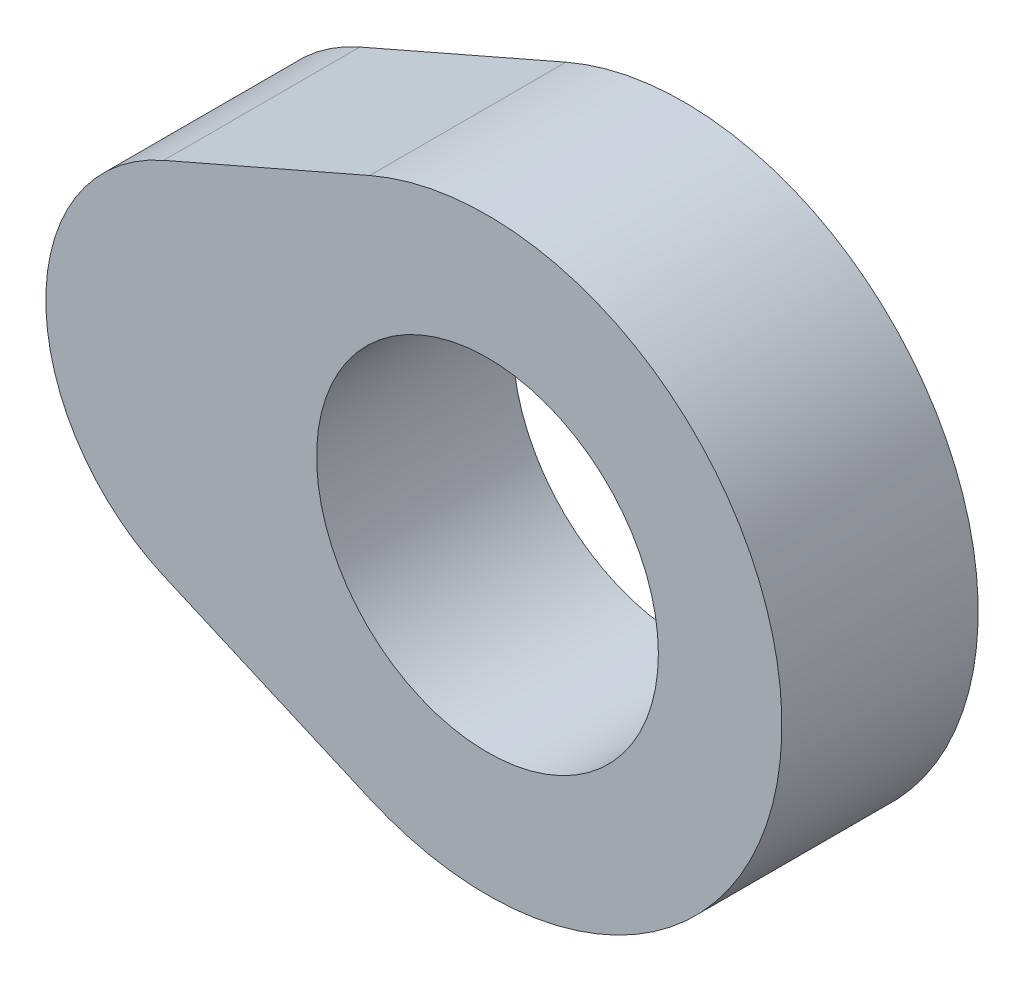
ISO-10303-21;
HEADER;
FILE_DESCRIPTION(('STEP AP214'),'2;1');
FILE_NAME('part.step','',(''),(''),'','','');
FILE_SCHEMA(('AUTOMOTIVE_DESIGN { 1 0 10303 214 1 1 1 1 }'));
ENDSEC;
DATA;
#1=APPLICATION_CONTEXT('core data for automotive mechanical design processes');
#2=APPLICATION_PROTOCOL_DEFINITION('international standard','automotive_design',2000,#1);
#3=PRODUCT_CONTEXT('',#1,'mechanical');
#4=PRODUCT('Part','Part','',(#3));
#5=PRODUCT_RELATED_PRODUCT_CATEGORY('part','',(#4));
#6=PRODUCT_DEFINITION_FORMATION('','',#4);
#7=PRODUCT_DEFINITION_CONTEXT('part definition',#1,'design');
#8=PRODUCT_DEFINITION('design','',#6,#7);
#9=PRODUCT_DEFINITION_SHAPE('','',#8);
#10=(LENGTH_UNIT() NAMED_UNIT(*) SI_UNIT(.MILLI.,.METRE.));
#11=(NAMED_UNIT(*) PLANE_ANGLE_UNIT() SI_UNIT($,.RADIAN.));
#12=(NAMED_UNIT(*) SI_UNIT($,.STERADIAN.) SOLID_ANGLE_UNIT());
#13=UNCERTAINTY_MEASURE_WITH_UNIT(LENGTH_MEASURE(1.E-05),#10,'distance_accuracy_value','');
#14=(GEOMETRIC_REPRESENTATION_CONTEXT(3) GLOBAL_UNCERTAINTY_ASSIGNED_CONTEXT((#13)) GLOBAL_UNIT_ASSIGNED_CONTEXT((#10,
#11,#12)) REPRESENTATION_CONTEXT('',''));
#15=CARTESIAN_POINT('',(0.,0.,0.));
#16=DIRECTION('',(0.,0.,1.));
#17=DIRECTION('',(1.,0.,0.));
#18=AXIS2_PLACEMENT_3D('',#15,#16,#17);
#19=CARTESIAN_POINT('',(0.,0.,20.));
#20=DIRECTION('',(0.,0.,1.));
#21=DIRECTION('',(1.,0.,0.));
#22=AXIS2_PLACEMENT_3D('',#19,#20,#21);
#23=PLANE('',#22);
#24=CARTESIAN_POINT('',(0.,0.,20.));
#25=DIRECTION('',(0.,0.,1.));
#26=DIRECTION('',(1.,0.,0.));
#27=AXIS2_PLACEMENT_3D('',#24,#25,#26);
#28=CIRCLE('',#27,60.);
#29=CARTESIAN_POINT('',(-24.,-54.9909083394701,20.));
#30=VERTEX_POINT('',#29);
#31=CARTESIAN_POINT('',(-24.,54.9909083394701,20.));
#32=VERTEX_POINT('',#31);
#33=EDGE_CURVE('E96',#30,#32,#28,.T.);
#34=ORIENTED_EDGE('',*,*,#33,.T.);
#35=DIRECTION('',(-0.916515138991168,-0.4,0.));
#36=VECTOR('',#35,1.);
#37=CARTESIAN_POINT('',(-65.9999999999992,36.6606055596471,20.));
#38=LINE('',#37,#36);
#39=CARTESIAN_POINT('',(-65.9999999999992,36.6606055596471,20.));
#40=VERTEX_POINT('',#39);
#41=EDGE_CURVE('E91',#32,#40,#38,.T.);
#42=ORIENTED_EDGE('',*,*,#41,.T.);
#43=CARTESIAN_POINT('',(-50.,0.,20.));
#44=DIRECTION('',(0.,0.,1.));
#45=DIRECTION('',(-1.,0.,0.));
#46=AXIS2_PLACEMENT_3D('',#43,#44,#45);
#47=CIRCLE('',#46,40.);
#48=CARTESIAN_POINT('',(-65.9999999999992,-36.6606055596471,20.));
#49=VERTEX_POINT('',#48);
#50=EDGE_CURVE('E94',#40,#49,#47,.T.);
#51=ORIENTED_EDGE('',*,*,#50,.T.);
#52=DIRECTION('',(0.916515138991168,-0.4,0.));
#53=VECTOR('',#52,1.);
#54=CARTESIAN_POINT('',(-65.9999999999992,-36.6606055596471,20.));
#55=LINE('',#54,#53);
#56=EDGE_CURVE('E61',#49,#30,#55,.T.);
#57=ORIENTED_EDGE('',*,*,#56,.T.);
#58=EDGE_LOOP('',(#34,#42,#51,#57));
#59=FACE_BOUND('',#58,.T.);
#60=CARTESIAN_POINT('',(0.,0.,20.));
#61=DIRECTION('',(0.,0.,1.));
#62=DIRECTION('',(1.,0.,0.));
#63=AXIS2_PLACEMENT_3D('',#60,#61,#62);
#64=CIRCLE('',#63,34.8235701882246);
#65=CARTESIAN_POINT('',(34.8235701882246,0.,20.));
#66=VERTEX_POINT('',#65);
#67=EDGE_CURVE('E116',#66,#66,#64,.T.);
#68=ORIENTED_EDGE('',*,*,#67,.F.);
#69=EDGE_LOOP('',(#68));
#70=FACE_BOUND('',#69,.T.);
#71=ADVANCED_FACE('F43',(#59,#70),#23,.T.);
#72=CARTESIAN_POINT('',(0.,0.,-20.));
#73=DIRECTION('',(0.,0.,1.));
#74=DIRECTION('',(1.,0.,0.));
#75=AXIS2_PLACEMENT_3D('',#72,#73,#74);
#76=PLANE('',#75);
#77=CARTESIAN_POINT('',(0.,0.,-20.));
#78=DIRECTION('',(0.,0.,1.));
#79=DIRECTION('',(1.,0.,0.));
#80=AXIS2_PLACEMENT_3D('',#77,#78,#79);
#81=CIRCLE('',#80,60.);
#82=CARTESIAN_POINT('',(-24.,-54.9909083394701,-20.));
#83=VERTEX_POINT('',#82);
#84=CARTESIAN_POINT('',(-24.,54.9909083394701,-20.));
#85=VERTEX_POINT('',#84);
#86=EDGE_CURVE('E112',#83,#85,#81,.T.);
#87=ORIENTED_EDGE('',*,*,#86,.F.);
#88=DIRECTION('',(0.916515138991168,-0.4,0.));
#89=VECTOR('',#88,1.);
#90=CARTESIAN_POINT('',(-65.9999999999992,-36.6606055596471,-20.));
#91=LINE('',#90,#89);
#92=CARTESIAN_POINT('',(-65.9999999999992,-36.6606055596471,-20.));
#93=VERTEX_POINT('',#92);
#94=EDGE_CURVE('E84',#93,#83,#91,.T.);
#95=ORIENTED_EDGE('',*,*,#94,.F.);
#96=CARTESIAN_POINT('',(-50.,0.,-20.));
#97=DIRECTION('',(0.,0.,1.));
#98=DIRECTION('',(-1.,0.,0.));
#99=AXIS2_PLACEMENT_3D('',#96,#97,#98);
#100=CIRCLE('',#99,40.);
#101=CARTESIAN_POINT('',(-65.9999999999992,36.6606055596471,-20.));
#102=VERTEX_POINT('',#101);
#103=EDGE_CURVE('E78',#102,#93,#100,.T.);
#104=ORIENTED_EDGE('',*,*,#103,.F.);
#105=DIRECTION('',(-0.916515138991168,-0.4,0.));
#106=VECTOR('',#105,1.);
#107=CARTESIAN_POINT('',(-65.9999999999992,36.6606055596471,-20.));
#108=LINE('',#107,#106);
#109=EDGE_CURVE('E101',#85,#102,#108,.T.);
#110=ORIENTED_EDGE('',*,*,#109,.F.);
#111=EDGE_LOOP('',(#87,#95,#104,#110));
#112=FACE_BOUND('',#111,.T.);
#113=CARTESIAN_POINT('',(0.,0.,-20.));
#114=DIRECTION('',(0.,0.,1.));
#115=DIRECTION('',(1.,0.,0.));
#116=AXIS2_PLACEMENT_3D('',#113,#114,#115);
#117=CIRCLE('',#116,34.8235701882246);
#118=CARTESIAN_POINT('',(34.8235701882246,0.,-20.));
#119=VERTEX_POINT('',#118);
#120=EDGE_CURVE('E134',#119,#119,#117,.T.);
#121=ORIENTED_EDGE('',*,*,#120,.T.);
#122=EDGE_LOOP('',(#121));
#123=FACE_BOUND('',#122,.T.);
#124=ADVANCED_FACE('F129',(#112,#123),#76,.F.);
#125=CARTESIAN_POINT('',(0.,0.,20.));
#126=DIRECTION('',(0.,0.,-1.));
#127=DIRECTION('',(-1.,0.,0.));
#128=AXIS2_PLACEMENT_3D('',#125,#126,#127);
#129=CYLINDRICAL_SURFACE('',#128,60.);
#130=ORIENTED_EDGE('',*,*,#86,.T.);
#131=DIRECTION('',(0.,0.,-1.));
#132=VECTOR('',#131,1.);
#133=CARTESIAN_POINT('',(-24.,54.9909083394701,20.));
#134=LINE('',#133,#132);
#135=EDGE_CURVE('E11',#32,#85,#134,.T.);
#136=ORIENTED_EDGE('',*,*,#135,.F.);
#137=ORIENTED_EDGE('',*,*,#33,.F.);
#138=DIRECTION('',(0.,0.,-1.));
#139=VECTOR('',#138,1.);
#140=CARTESIAN_POINT('',(-24.,-54.9909083394701,20.));
#141=LINE('',#140,#139);
#142=EDGE_CURVE('E108',#30,#83,#141,.T.);
#143=ORIENTED_EDGE('',*,*,#142,.T.);
#144=EDGE_LOOP('',(#130,#136,#137,#143));
#145=FACE_BOUND('',#144,.T.);
#146=ADVANCED_FACE('F45',(#145),#129,.T.);
#147=CARTESIAN_POINT('',(-65.9999999999992,36.6606055596471,20.));
#148=DIRECTION('',(0.4,-0.916515138991168,0.));
#149=DIRECTION('',(0.916515138991168,0.4,0.));
#150=AXIS2_PLACEMENT_3D('',#147,#148,#149);
#151=PLANE('',#150);
#152=ORIENTED_EDGE('',*,*,#109,.T.);
#153=DIRECTION('',(0.,0.,-1.));
#154=VECTOR('',#153,1.);
#155=CARTESIAN_POINT('',(-65.9999999999992,36.6606055596471,20.));
#156=LINE('',#155,#154);
#157=EDGE_CURVE('E53',#40,#102,#156,.T.);
#158=ORIENTED_EDGE('',*,*,#157,.F.);
#159=ORIENTED_EDGE('',*,*,#41,.F.);
#160=ORIENTED_EDGE('',*,*,#135,.T.);
#161=EDGE_LOOP('',(#152,#158,#159,#160));
#162=FACE_BOUND('',#161,.T.);
#163=ADVANCED_FACE('F100',(#162),#151,.F.);
#164=CARTESIAN_POINT('',(-50.,0.,20.));
#165=DIRECTION('',(0.,0.,-1.));
#166=DIRECTION('',(-1.,0.,0.));
#167=AXIS2_PLACEMENT_3D('',#164,#165,#166);
#168=CYLINDRICAL_SURFACE('',#167,40.);
#169=ORIENTED_EDGE('',*,*,#103,.T.);
#170=DIRECTION('',(0.,0.,-1.));
#171=VECTOR('',#170,1.);
#172=CARTESIAN_POINT('',(-65.9999999999992,-36.6606055596471,20.));
#173=LINE('',#172,#171);
#174=EDGE_CURVE('E103',#49,#93,#173,.T.);
#175=ORIENTED_EDGE('',*,*,#174,.F.);
#176=ORIENTED_EDGE('',*,*,#50,.F.);
#177=ORIENTED_EDGE('',*,*,#157,.T.);
#178=EDGE_LOOP('',(#169,#175,#176,#177));
#179=FACE_BOUND('',#178,.T.);
#180=ADVANCED_FACE('F104',(#179),#168,.T.);
#181=CARTESIAN_POINT('',(-65.9999999999992,-36.6606055596471,20.));
#182=DIRECTION('',(0.4,0.916515138991168,0.));
#183=DIRECTION('',(-0.916515138991168,0.4,0.));
#184=AXIS2_PLACEMENT_3D('',#181,#182,#183);
#185=PLANE('',#184);
#186=ORIENTED_EDGE('',*,*,#94,.T.);
#187=ORIENTED_EDGE('',*,*,#142,.F.);
#188=ORIENTED_EDGE('',*,*,#56,.F.);
#189=ORIENTED_EDGE('',*,*,#174,.T.);
#190=EDGE_LOOP('',(#186,#187,#188,#189));
#191=FACE_BOUND('',#190,.T.);
#192=ADVANCED_FACE('F126',(#191),#185,.F.);
#193=CARTESIAN_POINT('',(0.,0.,20.));
#194=DIRECTION('',(0.,0.,-1.));
#195=DIRECTION('',(-1.,0.,0.));
#196=AXIS2_PLACEMENT_3D('',#193,#194,#195);
#197=CYLINDRICAL_SURFACE('',#196,34.8235701882246);
#198=ORIENTED_EDGE('',*,*,#67,.T.);
#199=EDGE_LOOP('',(#198));
#200=FACE_BOUND('',#199,.T.);
#201=ORIENTED_EDGE('',*,*,#120,.F.);
#202=EDGE_LOOP('',(#201));
#203=FACE_BOUND('',#202,.T.);
#204=ADVANCED_FACE('F142',(#200,#203),#197,.F.);
#205=CLOSED_SHELL('',(#71,#124,#146,#163,#180,#192,#204));
#206=MANIFOLD_SOLID_BREP('B2',#205);
#207=ADVANCED_BREP_SHAPE_REPRESENTATION('',(#18,#206),#14);
#208=SHAPE_DEFINITION_REPRESENTATION(#9,#207);
ENDSEC;
END-ISO-10303-21;
